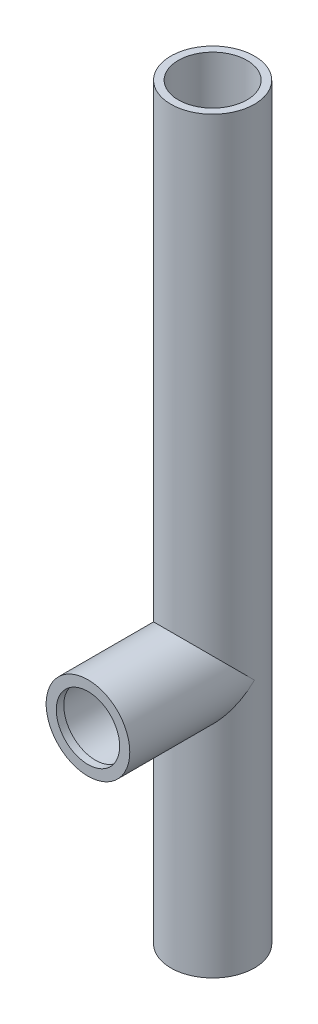
ISO-10303-21;
HEADER;
FILE_DESCRIPTION(('STEP AP214'),'2;1');
FILE_NAME('part.step','',(''),(''),'','','');
FILE_SCHEMA(('AUTOMOTIVE_DESIGN { 1 0 10303 214 1 1 1 1 }'));
ENDSEC;
DATA;
#1=APPLICATION_CONTEXT('core data for automotive mechanical design processes');
#2=APPLICATION_PROTOCOL_DEFINITION('international standard','automotive_design',2000,#1);
#3=PRODUCT_CONTEXT('',#1,'mechanical');
#4=PRODUCT('Part','Part','',(#3));
#5=PRODUCT_RELATED_PRODUCT_CATEGORY('part','',(#4));
#6=PRODUCT_DEFINITION_FORMATION('','',#4);
#7=PRODUCT_DEFINITION_CONTEXT('part definition',#1,'design');
#8=PRODUCT_DEFINITION('design','',#6,#7);
#9=PRODUCT_DEFINITION_SHAPE('','',#8);
#10=(LENGTH_UNIT() NAMED_UNIT(*) SI_UNIT(.MILLI.,.METRE.));
#11=(NAMED_UNIT(*) PLANE_ANGLE_UNIT() SI_UNIT($,.RADIAN.));
#12=(NAMED_UNIT(*) SI_UNIT($,.STERADIAN.) SOLID_ANGLE_UNIT());
#13=UNCERTAINTY_MEASURE_WITH_UNIT(LENGTH_MEASURE(1.E-05),#10,'distance_accuracy_value','');
#14=(GEOMETRIC_REPRESENTATION_CONTEXT(3) GLOBAL_UNCERTAINTY_ASSIGNED_CONTEXT((#13)) GLOBAL_UNIT_ASSIGNED_CONTEXT((#10,
#11,#12)) REPRESENTATION_CONTEXT('',''));
#15=CARTESIAN_POINT('',(0.,0.,0.));
#16=DIRECTION('',(0.,0.,1.));
#17=DIRECTION('',(1.,0.,0.));
#18=AXIS2_PLACEMENT_3D('',#15,#16,#17);
#19=CARTESIAN_POINT('',(0.,300.,0.));
#20=DIRECTION('',(0.,-1.,0.));
#21=DIRECTION('',(0.,0.,-1.));
#22=AXIS2_PLACEMENT_3D('',#19,#20,#21);
#23=CYLINDRICAL_SURFACE('',#22,16.764);
#24=CARTESIAN_POINT('',(0.,0.,0.));
#25=DIRECTION('',(0.,1.,0.));
#26=DIRECTION('',(0.,0.,1.));
#27=AXIS2_PLACEMENT_3D('',#24,#25,#26);
#28=CIRCLE('',#27,16.764);
#29=CARTESIAN_POINT('',(0.,0.,16.764));
#30=VERTEX_POINT('',#29);
#31=EDGE_CURVE('E77',#30,#30,#28,.T.);
#32=ORIENTED_EDGE('',*,*,#31,.T.);
#33=EDGE_LOOP('',(#32));
#34=FACE_BOUND('',#33,.T.);
#35=CARTESIAN_POINT('',(0.,300.,0.));
#36=DIRECTION('',(0.,1.,0.));
#37=DIRECTION('',(0.,0.,1.));
#38=AXIS2_PLACEMENT_3D('',#35,#36,#37);
#39=CIRCLE('',#38,16.764);
#40=CARTESIAN_POINT('',(0.,300.,16.764));
#41=VERTEX_POINT('',#40);
#42=EDGE_CURVE('E78',#41,#41,#39,.T.);
#43=ORIENTED_EDGE('',*,*,#42,.F.);
#44=EDGE_LOOP('',(#43));
#45=FACE_BOUND('',#44,.T.);
#46=CARTESIAN_POINT('',(0.,100.,0.));
#47=DIRECTION('',(0.,-0.707106781186547,-0.707106781186547));
#48=DIRECTION('',(0.,-0.707106781186547,0.707106781186547));
#49=AXIS2_PLACEMENT_3D('',#46,#47,#48);
#50=ELLIPSE('',#49,23.7078761596226,16.764);
#51=CARTESIAN_POINT('',(-16.764,100.,0.));
#52=VERTEX_POINT('',#51);
#53=CARTESIAN_POINT('',(16.764,100.,0.));
#54=VERTEX_POINT('',#53);
#55=EDGE_CURVE('E11',#52,#54,#50,.F.);
#56=ORIENTED_EDGE('',*,*,#55,.F.);
#57=CARTESIAN_POINT('',(0.,100.,0.));
#58=DIRECTION('',(0.,-0.707106781186547,0.707106781186547));
#59=DIRECTION('',(0.,-0.707106781186547,-0.707106781186547));
#60=AXIS2_PLACEMENT_3D('',#57,#58,#59);
#61=ELLIPSE('',#60,23.7078761596226,16.764);
#62=EDGE_CURVE('E43',#54,#52,#61,.T.);
#63=ORIENTED_EDGE('',*,*,#62,.F.);
#64=EDGE_LOOP('',(#56,#63));
#65=FACE_BOUND('',#64,.T.);
#66=ADVANCED_FACE('F35',(#34,#45,#65),#23,.T.);
#67=CARTESIAN_POINT('',(0.,300.,0.));
#68=DIRECTION('',(0.,1.,0.));
#69=DIRECTION('',(0.,0.,1.));
#70=AXIS2_PLACEMENT_3D('',#67,#68,#69);
#71=PLANE('',#70);
#72=CARTESIAN_POINT('',(0.,300.,0.));
#73=DIRECTION('',(0.,1.,0.));
#74=DIRECTION('',(0.,0.,1.));
#75=AXIS2_PLACEMENT_3D('',#72,#73,#74);
#76=CIRCLE('',#75,13.764);
#77=CARTESIAN_POINT('',(0.,300.,13.764));
#78=VERTEX_POINT('',#77);
#79=EDGE_CURVE('E66',#78,#78,#76,.T.);
#80=ORIENTED_EDGE('',*,*,#79,.F.);
#81=EDGE_LOOP('',(#80));
#82=FACE_BOUND('',#81,.T.);
#83=ORIENTED_EDGE('',*,*,#42,.T.);
#84=EDGE_LOOP('',(#83));
#85=FACE_BOUND('',#84,.T.);
#86=ADVANCED_FACE('F96',(#82,#85),#71,.T.);
#87=CARTESIAN_POINT('',(0.,0.,0.));
#88=DIRECTION('',(0.,1.,0.));
#89=DIRECTION('',(0.,0.,1.));
#90=AXIS2_PLACEMENT_3D('',#87,#88,#89);
#91=PLANE('',#90);
#92=CARTESIAN_POINT('',(0.,0.,0.));
#93=DIRECTION('',(0.,1.,0.));
#94=DIRECTION('',(0.,0.,1.));
#95=AXIS2_PLACEMENT_3D('',#92,#93,#94);
#96=CIRCLE('',#95,13.764);
#97=CARTESIAN_POINT('',(0.,0.,13.764));
#98=VERTEX_POINT('',#97);
#99=EDGE_CURVE('E139',#98,#98,#96,.T.);
#100=ORIENTED_EDGE('',*,*,#99,.T.);
#101=EDGE_LOOP('',(#100));
#102=FACE_BOUND('',#101,.T.);
#103=ORIENTED_EDGE('',*,*,#31,.F.);
#104=EDGE_LOOP('',(#103));
#105=FACE_BOUND('',#104,.T.);
#106=ADVANCED_FACE('F87',(#102,#105),#91,.F.);
#107=CARTESIAN_POINT('',(0.,100.,50.));
#108=DIRECTION('',(0.,0.,-1.));
#109=DIRECTION('',(-1.,0.,0.));
#110=AXIS2_PLACEMENT_3D('',#107,#108,#109);
#111=CYLINDRICAL_SURFACE('',#110,16.764);
#112=CARTESIAN_POINT('',(0.,100.,50.));
#113=DIRECTION('',(0.,0.,1.));
#114=DIRECTION('',(1.,0.,0.));
#115=AXIS2_PLACEMENT_3D('',#112,#113,#114);
#116=CIRCLE('',#115,16.764);
#117=CARTESIAN_POINT('',(16.764,100.,50.));
#118=VERTEX_POINT('',#117);
#119=EDGE_CURVE('E62',#118,#118,#116,.T.);
#120=ORIENTED_EDGE('',*,*,#119,.F.);
#121=EDGE_LOOP('',(#120));
#122=FACE_BOUND('',#121,.T.);
#123=ORIENTED_EDGE('',*,*,#62,.T.);
#124=ORIENTED_EDGE('',*,*,#55,.T.);
#125=EDGE_LOOP('',(#123,#124));
#126=FACE_BOUND('',#125,.T.);
#127=ADVANCED_FACE('F84',(#122,#126),#111,.T.);
#128=CARTESIAN_POINT('',(0.,100.,50.));
#129=DIRECTION('',(0.,0.,1.));
#130=DIRECTION('',(1.,0.,0.));
#131=AXIS2_PLACEMENT_3D('',#128,#129,#130);
#132=PLANE('',#131);
#133=CARTESIAN_POINT('',(0.,100.,50.));
#134=DIRECTION('',(0.,0.,1.));
#135=DIRECTION('',(1.,0.,0.));
#136=AXIS2_PLACEMENT_3D('',#133,#134,#135);
#137=CIRCLE('',#136,12.7);
#138=CARTESIAN_POINT('',(12.7,100.,50.));
#139=VERTEX_POINT('',#138);
#140=EDGE_CURVE('E137',#139,#139,#137,.T.);
#141=ORIENTED_EDGE('',*,*,#140,.F.);
#142=EDGE_LOOP('',(#141));
#143=FACE_BOUND('',#142,.T.);
#144=ORIENTED_EDGE('',*,*,#119,.T.);
#145=EDGE_LOOP('',(#144));
#146=FACE_BOUND('',#145,.T.);
#147=ADVANCED_FACE('F86',(#143,#146),#132,.T.);
#148=CARTESIAN_POINT('',(0.,300.,0.));
#149=DIRECTION('',(0.,-1.,0.));
#150=DIRECTION('',(0.,0.,-1.));
#151=AXIS2_PLACEMENT_3D('',#148,#149,#150);
#152=CYLINDRICAL_SURFACE('',#151,13.764);
#153=ORIENTED_EDGE('',*,*,#79,.T.);
#154=EDGE_LOOP('',(#153));
#155=FACE_BOUND('',#154,.T.);
#156=CARTESIAN_POINT('',(0.,100.,0.));
#157=DIRECTION('',(0.,-0.707106781186547,-0.707106781186547));
#158=DIRECTION('',(0.,-0.707106781186547,0.707106781186547));
#159=AXIS2_PLACEMENT_3D('',#156,#157,#158);
#160=ELLIPSE('',#159,19.4652354725033,13.764);
#161=CARTESIAN_POINT('',(-13.764,100.,0.));
#162=VERTEX_POINT('',#161);
#163=CARTESIAN_POINT('',(13.764,100.,0.));
#164=VERTEX_POINT('',#163);
#165=EDGE_CURVE('E57',#162,#164,#160,.F.);
#166=ORIENTED_EDGE('',*,*,#165,.T.);
#167=CARTESIAN_POINT('',(0.,100.,0.));
#168=DIRECTION('',(0.,-0.707106781186547,0.707106781186547));
#169=DIRECTION('',(0.,-0.707106781186547,-0.707106781186547));
#170=AXIS2_PLACEMENT_3D('',#167,#168,#169);
#171=ELLIPSE('',#170,19.4652354725033,13.764);
#172=EDGE_CURVE('E60',#164,#162,#171,.T.);
#173=ORIENTED_EDGE('',*,*,#172,.T.);
#174=EDGE_LOOP('',(#166,#173));
#175=FACE_BOUND('',#174,.T.);
#176=ORIENTED_EDGE('',*,*,#99,.F.);
#177=EDGE_LOOP('',(#176));
#178=FACE_BOUND('',#177,.T.);
#179=ADVANCED_FACE('F64',(#155,#175,#178),#152,.F.);
#180=CARTESIAN_POINT('',(0.,100.,50.));
#181=DIRECTION('',(0.,0.,-1.));
#182=DIRECTION('',(-1.,0.,0.));
#183=AXIS2_PLACEMENT_3D('',#180,#181,#182);
#184=CYLINDRICAL_SURFACE('',#183,13.764);
#185=CARTESIAN_POINT('',(0.,100.,47.));
#186=DIRECTION('',(0.,0.,1.));
#187=DIRECTION('',(1.,0.,0.));
#188=AXIS2_PLACEMENT_3D('',#185,#186,#187);
#189=CIRCLE('',#188,13.764);
#190=CARTESIAN_POINT('',(13.764,100.,47.));
#191=VERTEX_POINT('',#190);
#192=EDGE_CURVE('E69',#191,#191,#189,.T.);
#193=ORIENTED_EDGE('',*,*,#192,.T.);
#194=EDGE_LOOP('',(#193));
#195=FACE_BOUND('',#194,.T.);
#196=ORIENTED_EDGE('',*,*,#172,.F.);
#197=ORIENTED_EDGE('',*,*,#165,.F.);
#198=EDGE_LOOP('',(#196,#197));
#199=FACE_BOUND('',#198,.T.);
#200=ADVANCED_FACE('F59',(#195,#199),#184,.F.);
#201=CARTESIAN_POINT('',(0.,100.,47.));
#202=DIRECTION('',(0.,0.,1.));
#203=DIRECTION('',(1.,0.,0.));
#204=AXIS2_PLACEMENT_3D('',#201,#202,#203);
#205=PLANE('',#204);
#206=CARTESIAN_POINT('',(0.,100.,47.));
#207=DIRECTION('',(0.,0.,1.));
#208=DIRECTION('',(1.,0.,0.));
#209=AXIS2_PLACEMENT_3D('',#206,#207,#208);
#210=CIRCLE('',#209,12.7);
#211=CARTESIAN_POINT('',(12.7,100.,47.));
#212=VERTEX_POINT('',#211);
#213=EDGE_CURVE('E38',#212,#212,#210,.T.);
#214=ORIENTED_EDGE('',*,*,#213,.T.);
#215=EDGE_LOOP('',(#214));
#216=FACE_BOUND('',#215,.T.);
#217=ORIENTED_EDGE('',*,*,#192,.F.);
#218=EDGE_LOOP('',(#217));
#219=FACE_BOUND('',#218,.T.);
#220=ADVANCED_FACE('F120',(#216,#219),#205,.F.);
#221=CARTESIAN_POINT('',(0.,100.,30.));
#222=DIRECTION('',(0.,0.,1.));
#223=DIRECTION('',(1.,0.,0.));
#224=AXIS2_PLACEMENT_3D('',#221,#222,#223);
#225=CYLINDRICAL_SURFACE('',#224,12.7);
#226=ORIENTED_EDGE('',*,*,#140,.T.);
#227=EDGE_LOOP('',(#226));
#228=FACE_BOUND('',#227,.T.);
#229=ORIENTED_EDGE('',*,*,#213,.F.);
#230=EDGE_LOOP('',(#229));
#231=FACE_BOUND('',#230,.T.);
#232=ADVANCED_FACE('F124',(#228,#231),#225,.F.);
#233=CLOSED_SHELL('',(#66,#86,#106,#127,#147,#179,#200,#220,#232));
#234=MANIFOLD_SOLID_BREP('B2',#233);
#235=ADVANCED_BREP_SHAPE_REPRESENTATION('',(#18,#234),#14);
#236=SHAPE_DEFINITION_REPRESENTATION(#9,#235);
ENDSEC;
END-ISO-10303-21;
